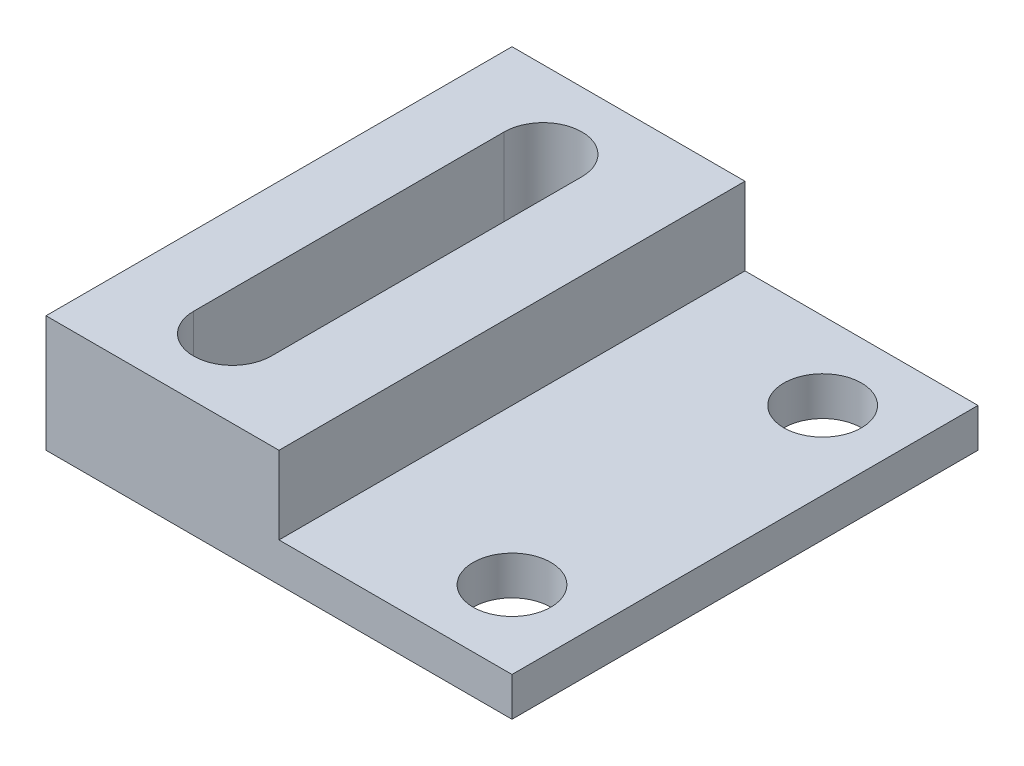
ISO-10303-21;
HEADER;
FILE_DESCRIPTION(('STEP AP214'),'2;1');
FILE_NAME('part.step','',(''),(''),'','','');
FILE_SCHEMA(('AUTOMOTIVE_DESIGN { 1 0 10303 214 1 1 1 1 }'));
ENDSEC;
DATA;
#1=APPLICATION_CONTEXT('core data for automotive mechanical design processes');
#2=APPLICATION_PROTOCOL_DEFINITION('international standard','automotive_design',2000,#1);
#3=PRODUCT_CONTEXT('',#1,'mechanical');
#4=PRODUCT('Part','Part','',(#3));
#5=PRODUCT_RELATED_PRODUCT_CATEGORY('part','',(#4));
#6=PRODUCT_DEFINITION_FORMATION('','',#4);
#7=PRODUCT_DEFINITION_CONTEXT('part definition',#1,'design');
#8=PRODUCT_DEFINITION('design','',#6,#7);
#9=PRODUCT_DEFINITION_SHAPE('','',#8);
#10=(LENGTH_UNIT() NAMED_UNIT(*) SI_UNIT(.MILLI.,.METRE.));
#11=(NAMED_UNIT(*) PLANE_ANGLE_UNIT() SI_UNIT($,.RADIAN.));
#12=(NAMED_UNIT(*) SI_UNIT($,.STERADIAN.) SOLID_ANGLE_UNIT());
#13=UNCERTAINTY_MEASURE_WITH_UNIT(LENGTH_MEASURE(1.E-05),#10,'distance_accuracy_value','');
#14=(GEOMETRIC_REPRESENTATION_CONTEXT(3) GLOBAL_UNCERTAINTY_ASSIGNED_CONTEXT((#13)) GLOBAL_UNIT_ASSIGNED_CONTEXT((#10,
#11,#12)) REPRESENTATION_CONTEXT('',''));
#15=CARTESIAN_POINT('',(0.,0.,0.));
#16=DIRECTION('',(0.,0.,1.));
#17=DIRECTION('',(1.,0.,0.));
#18=AXIS2_PLACEMENT_3D('',#15,#16,#17);
#19=CARTESIAN_POINT('',(19.05,-4.7625,19.05));
#20=DIRECTION('',(-1.,0.,0.));
#21=DIRECTION('',(0.,0.,1.));
#22=AXIS2_PLACEMENT_3D('',#19,#20,#21);
#23=PLANE('',#22);
#24=DIRECTION('',(0.,1.,0.));
#25=VECTOR('',#24,1.);
#26=CARTESIAN_POINT('',(19.05,-4.7625,-19.05));
#27=LINE('',#26,#25);
#28=CARTESIAN_POINT('',(19.05,-4.7625,-19.05));
#29=VERTEX_POINT('',#28);
#30=CARTESIAN_POINT('',(19.05,-1.5875,-19.05));
#31=VERTEX_POINT('',#30);
#32=EDGE_CURVE('E186',#29,#31,#27,.T.);
#33=ORIENTED_EDGE('',*,*,#32,.T.);
#34=DIRECTION('',(0.,0.,1.));
#35=VECTOR('',#34,1.);
#36=CARTESIAN_POINT('',(19.05,-1.5875,-19.05));
#37=LINE('',#36,#35);
#38=CARTESIAN_POINT('',(19.05,-1.5875,19.05));
#39=VERTEX_POINT('',#38);
#40=EDGE_CURVE('E187',#31,#39,#37,.T.);
#41=ORIENTED_EDGE('',*,*,#40,.T.);
#42=DIRECTION('',(0.,1.,0.));
#43=VECTOR('',#42,1.);
#44=CARTESIAN_POINT('',(19.05,-4.7625,19.05));
#45=LINE('',#44,#43);
#46=CARTESIAN_POINT('',(19.05,-4.7625,19.05));
#47=VERTEX_POINT('',#46);
#48=EDGE_CURVE('E193',#47,#39,#45,.T.);
#49=ORIENTED_EDGE('',*,*,#48,.F.);
#50=DIRECTION('',(0.,0.,-1.));
#51=VECTOR('',#50,1.);
#52=CARTESIAN_POINT('',(19.05,-4.7625,19.05));
#53=LINE('',#52,#51);
#54=EDGE_CURVE('E207',#47,#29,#53,.T.);
#55=ORIENTED_EDGE('',*,*,#54,.T.);
#56=EDGE_LOOP('',(#33,#41,#49,#55));
#57=FACE_BOUND('',#56,.T.);
#58=ADVANCED_FACE('F39',(#57),#23,.F.);
#59=CARTESIAN_POINT('',(-19.05,4.7625,19.05));
#60=DIRECTION('',(0.,-1.,0.));
#61=DIRECTION('',(0.,0.,-1.));
#62=AXIS2_PLACEMENT_3D('',#59,#60,#61);
#63=PLANE('',#62);
#64=DIRECTION('',(0.,0.,-1.));
#65=VECTOR('',#64,1.);
#66=CARTESIAN_POINT('',(-6.985,4.7625,12.7));
#67=LINE('',#66,#65);
#68=CARTESIAN_POINT('',(-6.985,4.7625,12.7));
#69=VERTEX_POINT('',#68);
#70=CARTESIAN_POINT('',(-6.985,4.7625,-12.7));
#71=VERTEX_POINT('',#70);
#72=EDGE_CURVE('E129',#69,#71,#67,.T.);
#73=ORIENTED_EDGE('',*,*,#72,.F.);
#74=CARTESIAN_POINT('',(-10.16,4.7625,12.7));
#75=DIRECTION('',(0.,1.,0.));
#76=DIRECTION('',(0.,0.,1.));
#77=AXIS2_PLACEMENT_3D('',#74,#75,#76);
#78=CIRCLE('',#77,3.175);
#79=CARTESIAN_POINT('',(-13.335,4.7625,12.7));
#80=VERTEX_POINT('',#79);
#81=EDGE_CURVE('E54',#80,#69,#78,.T.);
#82=ORIENTED_EDGE('',*,*,#81,.F.);
#83=DIRECTION('',(0.,0.,1.));
#84=VECTOR('',#83,1.);
#85=CARTESIAN_POINT('',(-13.335,4.7625,12.7));
#86=LINE('',#85,#84);
#87=CARTESIAN_POINT('',(-13.335,4.7625,-12.7));
#88=VERTEX_POINT('',#87);
#89=EDGE_CURVE('E137',#88,#80,#86,.T.);
#90=ORIENTED_EDGE('',*,*,#89,.F.);
#91=CARTESIAN_POINT('',(-10.16,4.7625,-12.7));
#92=DIRECTION('',(0.,1.,0.));
#93=DIRECTION('',(0.,0.,1.));
#94=AXIS2_PLACEMENT_3D('',#91,#92,#93);
#95=CIRCLE('',#94,3.175);
#96=EDGE_CURVE('E119',#71,#88,#95,.T.);
#97=ORIENTED_EDGE('',*,*,#96,.F.);
#98=EDGE_LOOP('',(#73,#82,#90,#97));
#99=FACE_BOUND('',#98,.T.);
#100=DIRECTION('',(-1.,0.,0.));
#101=VECTOR('',#100,1.);
#102=CARTESIAN_POINT('',(-19.05,4.7625,19.05));
#103=LINE('',#102,#101);
#104=CARTESIAN_POINT('',(0.,4.7625,19.05));
#105=VERTEX_POINT('',#104);
#106=CARTESIAN_POINT('',(-19.05,4.7625,19.05));
#107=VERTEX_POINT('',#106);
#108=EDGE_CURVE('E197',#105,#107,#103,.T.);
#109=ORIENTED_EDGE('',*,*,#108,.F.);
#110=DIRECTION('',(0.,0.,1.));
#111=VECTOR('',#110,1.);
#112=CARTESIAN_POINT('',(0.,4.7625,-19.05));
#113=LINE('',#112,#111);
#114=CARTESIAN_POINT('',(0.,4.7625,-19.05));
#115=VERTEX_POINT('',#114);
#116=EDGE_CURVE('E183',#115,#105,#113,.T.);
#117=ORIENTED_EDGE('',*,*,#116,.F.);
#118=DIRECTION('',(-1.,0.,0.));
#119=VECTOR('',#118,1.);
#120=CARTESIAN_POINT('',(-19.05,4.7625,-19.05));
#121=LINE('',#120,#119);
#122=CARTESIAN_POINT('',(-19.05,4.7625,-19.05));
#123=VERTEX_POINT('',#122);
#124=EDGE_CURVE('E211',#115,#123,#121,.T.);
#125=ORIENTED_EDGE('',*,*,#124,.T.);
#126=DIRECTION('',(0.,0.,-1.));
#127=VECTOR('',#126,1.);
#128=CARTESIAN_POINT('',(-19.05,4.7625,19.05));
#129=LINE('',#128,#127);
#130=EDGE_CURVE('E226',#107,#123,#129,.T.);
#131=ORIENTED_EDGE('',*,*,#130,.F.);
#132=EDGE_LOOP('',(#109,#117,#125,#131));
#133=FACE_BOUND('',#132,.T.);
#134=ADVANCED_FACE('F134',(#99,#133),#63,.F.);
#135=CARTESIAN_POINT('',(-19.05,-4.7625,19.05));
#136=DIRECTION('',(1.,0.,0.));
#137=DIRECTION('',(0.,0.,-1.));
#138=AXIS2_PLACEMENT_3D('',#135,#136,#137);
#139=PLANE('',#138);
#140=DIRECTION('',(0.,-1.,0.));
#141=VECTOR('',#140,1.);
#142=CARTESIAN_POINT('',(-19.05,-4.7625,-19.05));
#143=LINE('',#142,#141);
#144=CARTESIAN_POINT('',(-19.05,-4.7625,-19.05));
#145=VERTEX_POINT('',#144);
#146=EDGE_CURVE('E214',#123,#145,#143,.T.);
#147=ORIENTED_EDGE('',*,*,#146,.T.);
#148=DIRECTION('',(0.,0.,-1.));
#149=VECTOR('',#148,1.);
#150=CARTESIAN_POINT('',(-19.05,-4.7625,19.05));
#151=LINE('',#150,#149);
#152=CARTESIAN_POINT('',(-19.05,-4.7625,19.05));
#153=VERTEX_POINT('',#152);
#154=EDGE_CURVE('E222',#153,#145,#151,.T.);
#155=ORIENTED_EDGE('',*,*,#154,.F.);
#156=DIRECTION('',(0.,-1.,0.));
#157=VECTOR('',#156,1.);
#158=CARTESIAN_POINT('',(-19.05,-4.7625,19.05));
#159=LINE('',#158,#157);
#160=EDGE_CURVE('E201',#107,#153,#159,.T.);
#161=ORIENTED_EDGE('',*,*,#160,.F.);
#162=ORIENTED_EDGE('',*,*,#130,.T.);
#163=EDGE_LOOP('',(#147,#155,#161,#162));
#164=FACE_BOUND('',#163,.T.);
#165=ADVANCED_FACE('F260',(#164),#139,.F.);
#166=CARTESIAN_POINT('',(-19.05,-4.7625,19.05));
#167=DIRECTION('',(0.,1.,0.));
#168=DIRECTION('',(0.,0.,1.));
#169=AXIS2_PLACEMENT_3D('',#166,#167,#168);
#170=PLANE('',#169);
#171=DIRECTION('',(0.,0.,1.));
#172=VECTOR('',#171,1.);
#173=CARTESIAN_POINT('',(-13.335,-4.7625,19.05));
#174=LINE('',#173,#172);
#175=CARTESIAN_POINT('',(-13.335,-4.7625,-12.7));
#176=VERTEX_POINT('',#175);
#177=CARTESIAN_POINT('',(-13.335,-4.7625,12.7));
#178=VERTEX_POINT('',#177);
#179=EDGE_CURVE('E47',#176,#178,#174,.T.);
#180=ORIENTED_EDGE('',*,*,#179,.T.);
#181=CARTESIAN_POINT('',(-10.16,-4.7625,12.7));
#182=DIRECTION('',(0.,1.,0.));
#183=DIRECTION('',(0.,0.,1.));
#184=AXIS2_PLACEMENT_3D('',#181,#182,#183);
#185=CIRCLE('',#184,3.175);
#186=CARTESIAN_POINT('',(-6.985,-4.7625,12.7));
#187=VERTEX_POINT('',#186);
#188=EDGE_CURVE('E11',#178,#187,#185,.T.);
#189=ORIENTED_EDGE('',*,*,#188,.T.);
#190=DIRECTION('',(0.,0.,-1.));
#191=VECTOR('',#190,1.);
#192=CARTESIAN_POINT('',(-6.985,-4.7625,19.05));
#193=LINE('',#192,#191);
#194=CARTESIAN_POINT('',(-6.985,-4.7625,-12.7));
#195=VERTEX_POINT('',#194);
#196=EDGE_CURVE('E230',#187,#195,#193,.T.);
#197=ORIENTED_EDGE('',*,*,#196,.T.);
#198=CARTESIAN_POINT('',(-10.16,-4.7625,-12.7));
#199=DIRECTION('',(0.,1.,0.));
#200=DIRECTION('',(0.,0.,1.));
#201=AXIS2_PLACEMENT_3D('',#198,#199,#200);
#202=CIRCLE('',#201,3.175);
#203=EDGE_CURVE('E122',#195,#176,#202,.T.);
#204=ORIENTED_EDGE('',*,*,#203,.T.);
#205=EDGE_LOOP('',(#180,#189,#197,#204));
#206=FACE_BOUND('',#205,.T.);
#207=CARTESIAN_POINT('',(12.7,-4.7625,-12.7));
#208=DIRECTION('',(0.,1.,0.));
#209=DIRECTION('',(0.,0.,1.));
#210=AXIS2_PLACEMENT_3D('',#207,#208,#209);
#211=CIRCLE('',#210,3.175);
#212=CARTESIAN_POINT('',(12.7,-4.7625,-9.525));
#213=VERTEX_POINT('',#212);
#214=EDGE_CURVE('E155',#213,#213,#211,.T.);
#215=ORIENTED_EDGE('',*,*,#214,.T.);
#216=EDGE_LOOP('',(#215));
#217=FACE_BOUND('',#216,.T.);
#218=CARTESIAN_POINT('',(12.7,-4.7625,12.7));
#219=DIRECTION('',(0.,1.,0.));
#220=DIRECTION('',(0.,0.,1.));
#221=AXIS2_PLACEMENT_3D('',#218,#219,#220);
#222=CIRCLE('',#221,3.175);
#223=CARTESIAN_POINT('',(12.7,-4.7625,15.875));
#224=VERTEX_POINT('',#223);
#225=EDGE_CURVE('E163',#224,#224,#222,.T.);
#226=ORIENTED_EDGE('',*,*,#225,.T.);
#227=EDGE_LOOP('',(#226));
#228=FACE_BOUND('',#227,.T.);
#229=DIRECTION('',(1.,0.,0.));
#230=VECTOR('',#229,1.);
#231=CARTESIAN_POINT('',(-19.05,-4.7625,-19.05));
#232=LINE('',#231,#230);
#233=EDGE_CURVE('E198',#145,#29,#232,.T.);
#234=ORIENTED_EDGE('',*,*,#233,.T.);
#235=ORIENTED_EDGE('',*,*,#54,.F.);
#236=DIRECTION('',(1.,0.,0.));
#237=VECTOR('',#236,1.);
#238=CARTESIAN_POINT('',(-19.05,-4.7625,19.05));
#239=LINE('',#238,#237);
#240=EDGE_CURVE('E204',#153,#47,#239,.T.);
#241=ORIENTED_EDGE('',*,*,#240,.F.);
#242=ORIENTED_EDGE('',*,*,#154,.T.);
#243=EDGE_LOOP('',(#234,#235,#241,#242));
#244=FACE_BOUND('',#243,.T.);
#245=ADVANCED_FACE('F237',(#206,#217,#228,#244),#170,.F.);
#246=CARTESIAN_POINT('',(0.,0.,19.05));
#247=DIRECTION('',(0.,0.,-1.));
#248=DIRECTION('',(-1.,0.,0.));
#249=AXIS2_PLACEMENT_3D('',#246,#247,#248);
#250=PLANE('',#249);
#251=DIRECTION('',(1.,0.,0.));
#252=VECTOR('',#251,1.);
#253=CARTESIAN_POINT('',(0.,-1.5875,19.05));
#254=LINE('',#253,#252);
#255=CARTESIAN_POINT('',(0.,-1.5875,19.05));
#256=VERTEX_POINT('',#255);
#257=EDGE_CURVE('E173',#256,#39,#254,.T.);
#258=ORIENTED_EDGE('',*,*,#257,.F.);
#259=DIRECTION('',(0.,-1.,0.));
#260=VECTOR('',#259,1.);
#261=CARTESIAN_POINT('',(0.,-1.5875,19.05));
#262=LINE('',#261,#260);
#263=EDGE_CURVE('E167',#105,#256,#262,.T.);
#264=ORIENTED_EDGE('',*,*,#263,.F.);
#265=ORIENTED_EDGE('',*,*,#108,.T.);
#266=ORIENTED_EDGE('',*,*,#160,.T.);
#267=ORIENTED_EDGE('',*,*,#240,.T.);
#268=ORIENTED_EDGE('',*,*,#48,.T.);
#269=EDGE_LOOP('',(#258,#264,#265,#266,#267,#268));
#270=FACE_BOUND('',#269,.T.);
#271=ADVANCED_FACE('F275',(#270),#250,.F.);
#272=CARTESIAN_POINT('',(0.,0.,-19.05));
#273=DIRECTION('',(0.,0.,-1.));
#274=DIRECTION('',(-1.,0.,0.));
#275=AXIS2_PLACEMENT_3D('',#272,#273,#274);
#276=PLANE('',#275);
#277=DIRECTION('',(0.,-1.,0.));
#278=VECTOR('',#277,1.);
#279=CARTESIAN_POINT('',(0.,-1.5875,-19.05));
#280=LINE('',#279,#278);
#281=CARTESIAN_POINT('',(0.,-1.5875,-19.05));
#282=VERTEX_POINT('',#281);
#283=EDGE_CURVE('E168',#115,#282,#280,.T.);
#284=ORIENTED_EDGE('',*,*,#283,.T.);
#285=DIRECTION('',(1.,0.,0.));
#286=VECTOR('',#285,1.);
#287=CARTESIAN_POINT('',(0.,-1.5875,-19.05));
#288=LINE('',#287,#286);
#289=EDGE_CURVE('E172',#282,#31,#288,.T.);
#290=ORIENTED_EDGE('',*,*,#289,.T.);
#291=ORIENTED_EDGE('',*,*,#32,.F.);
#292=ORIENTED_EDGE('',*,*,#233,.F.);
#293=ORIENTED_EDGE('',*,*,#146,.F.);
#294=ORIENTED_EDGE('',*,*,#124,.F.);
#295=EDGE_LOOP('',(#284,#290,#291,#292,#293,#294));
#296=FACE_BOUND('',#295,.T.);
#297=ADVANCED_FACE('F266',(#296),#276,.T.);
#298=CARTESIAN_POINT('',(0.,-1.5875,-19.05));
#299=DIRECTION('',(-1.,0.,0.));
#300=DIRECTION('',(0.,0.,1.));
#301=AXIS2_PLACEMENT_3D('',#298,#299,#300);
#302=PLANE('',#301);
#303=ORIENTED_EDGE('',*,*,#263,.T.);
#304=DIRECTION('',(0.,0.,1.));
#305=VECTOR('',#304,1.);
#306=CARTESIAN_POINT('',(0.,-1.5875,-19.05));
#307=LINE('',#306,#305);
#308=EDGE_CURVE('E177',#282,#256,#307,.T.);
#309=ORIENTED_EDGE('',*,*,#308,.F.);
#310=ORIENTED_EDGE('',*,*,#283,.F.);
#311=ORIENTED_EDGE('',*,*,#116,.T.);
#312=EDGE_LOOP('',(#303,#309,#310,#311));
#313=FACE_BOUND('',#312,.T.);
#314=ADVANCED_FACE('F285',(#313),#302,.F.);
#315=CARTESIAN_POINT('',(0.,-1.5875,-19.05));
#316=DIRECTION('',(0.,-1.,0.));
#317=DIRECTION('',(0.,0.,-1.));
#318=AXIS2_PLACEMENT_3D('',#315,#316,#317);
#319=PLANE('',#318);
#320=CARTESIAN_POINT('',(12.7,-1.5875,-12.7));
#321=DIRECTION('',(0.,1.,0.));
#322=DIRECTION('',(0.,0.,1.));
#323=AXIS2_PLACEMENT_3D('',#320,#321,#322);
#324=CIRCLE('',#323,3.17499999999999);
#325=CARTESIAN_POINT('',(12.7,-1.5875,-9.52500000000001));
#326=VERTEX_POINT('',#325);
#327=EDGE_CURVE('E147',#326,#326,#324,.T.);
#328=ORIENTED_EDGE('',*,*,#327,.F.);
#329=EDGE_LOOP('',(#328));
#330=FACE_BOUND('',#329,.T.);
#331=CARTESIAN_POINT('',(12.7,-1.5875,12.7));
#332=DIRECTION('',(0.,1.,0.));
#333=DIRECTION('',(0.,0.,1.));
#334=AXIS2_PLACEMENT_3D('',#331,#332,#333);
#335=CIRCLE('',#334,3.17499999999999);
#336=CARTESIAN_POINT('',(12.7,-1.5875,15.875));
#337=VERTEX_POINT('',#336);
#338=EDGE_CURVE('E159',#337,#337,#335,.T.);
#339=ORIENTED_EDGE('',*,*,#338,.F.);
#340=EDGE_LOOP('',(#339));
#341=FACE_BOUND('',#340,.T.);
#342=ORIENTED_EDGE('',*,*,#257,.T.);
#343=ORIENTED_EDGE('',*,*,#40,.F.);
#344=ORIENTED_EDGE('',*,*,#289,.F.);
#345=ORIENTED_EDGE('',*,*,#308,.T.);
#346=EDGE_LOOP('',(#342,#343,#344,#345));
#347=FACE_BOUND('',#346,.T.);
#348=ADVANCED_FACE('F271',(#330,#341,#347),#319,.F.);
#349=CARTESIAN_POINT('',(12.7,-1.5875,12.7));
#350=DIRECTION('',(0.,1.,0.));
#351=DIRECTION('',(0.,0.,1.));
#352=AXIS2_PLACEMENT_3D('',#349,#350,#351);
#353=CYLINDRICAL_SURFACE('',#352,3.17499999999999);
#354=ORIENTED_EDGE('',*,*,#225,.F.);
#355=EDGE_LOOP('',(#354));
#356=FACE_BOUND('',#355,.T.);
#357=ORIENTED_EDGE('',*,*,#338,.T.);
#358=EDGE_LOOP('',(#357));
#359=FACE_BOUND('',#358,.T.);
#360=ADVANCED_FACE('F251',(#356,#359),#353,.F.);
#361=CARTESIAN_POINT('',(12.7,-1.5875,-12.7));
#362=DIRECTION('',(0.,1.,0.));
#363=DIRECTION('',(0.,0.,1.));
#364=AXIS2_PLACEMENT_3D('',#361,#362,#363);
#365=CYLINDRICAL_SURFACE('',#364,3.17499999999999);
#366=ORIENTED_EDGE('',*,*,#214,.F.);
#367=EDGE_LOOP('',(#366));
#368=FACE_BOUND('',#367,.T.);
#369=ORIENTED_EDGE('',*,*,#327,.T.);
#370=EDGE_LOOP('',(#369));
#371=FACE_BOUND('',#370,.T.);
#372=ADVANCED_FACE('F244',(#368,#371),#365,.F.);
#373=CARTESIAN_POINT('',(-10.16,-26.9875,12.7));
#374=DIRECTION('',(0.,1.,0.));
#375=DIRECTION('',(0.,0.,1.));
#376=AXIS2_PLACEMENT_3D('',#373,#374,#375);
#377=CYLINDRICAL_SURFACE('',#376,3.175);
#378=DIRECTION('',(0.,1.,0.));
#379=VECTOR('',#378,1.);
#380=CARTESIAN_POINT('',(-13.335,-26.9875,12.7));
#381=LINE('',#380,#379);
#382=EDGE_CURVE('E144',#178,#80,#381,.T.);
#383=ORIENTED_EDGE('',*,*,#382,.T.);
#384=ORIENTED_EDGE('',*,*,#81,.T.);
#385=DIRECTION('',(0.,1.,0.));
#386=VECTOR('',#385,1.);
#387=CARTESIAN_POINT('',(-6.985,-26.9875,12.7));
#388=LINE('',#387,#386);
#389=EDGE_CURVE('E126',#187,#69,#388,.T.);
#390=ORIENTED_EDGE('',*,*,#389,.F.);
#391=ORIENTED_EDGE('',*,*,#188,.F.);
#392=EDGE_LOOP('',(#383,#384,#390,#391));
#393=FACE_BOUND('',#392,.T.);
#394=ADVANCED_FACE('F242',(#393),#377,.F.);
#395=CARTESIAN_POINT('',(-13.335,-26.9875,12.7));
#396=DIRECTION('',(-1.,0.,0.));
#397=DIRECTION('',(0.,0.,1.));
#398=AXIS2_PLACEMENT_3D('',#395,#396,#397);
#399=PLANE('',#398);
#400=DIRECTION('',(0.,1.,0.));
#401=VECTOR('',#400,1.);
#402=CARTESIAN_POINT('',(-13.335,-26.9875,-12.7));
#403=LINE('',#402,#401);
#404=EDGE_CURVE('E125',#176,#88,#403,.T.);
#405=ORIENTED_EDGE('',*,*,#404,.T.);
#406=ORIENTED_EDGE('',*,*,#89,.T.);
#407=ORIENTED_EDGE('',*,*,#382,.F.);
#408=ORIENTED_EDGE('',*,*,#179,.F.);
#409=EDGE_LOOP('',(#405,#406,#407,#408));
#410=FACE_BOUND('',#409,.T.);
#411=ADVANCED_FACE('F241',(#410),#399,.F.);
#412=CARTESIAN_POINT('',(-10.16,-26.9875,-12.7));
#413=DIRECTION('',(0.,1.,0.));
#414=DIRECTION('',(0.,0.,1.));
#415=AXIS2_PLACEMENT_3D('',#412,#413,#414);
#416=CYLINDRICAL_SURFACE('',#415,3.175);
#417=DIRECTION('',(0.,1.,0.));
#418=VECTOR('',#417,1.);
#419=CARTESIAN_POINT('',(-6.985,-26.9875,-12.7));
#420=LINE('',#419,#418);
#421=EDGE_CURVE('E62',#195,#71,#420,.T.);
#422=ORIENTED_EDGE('',*,*,#421,.T.);
#423=ORIENTED_EDGE('',*,*,#96,.T.);
#424=ORIENTED_EDGE('',*,*,#404,.F.);
#425=ORIENTED_EDGE('',*,*,#203,.F.);
#426=EDGE_LOOP('',(#422,#423,#424,#425));
#427=FACE_BOUND('',#426,.T.);
#428=ADVANCED_FACE('F116',(#427),#416,.F.);
#429=CARTESIAN_POINT('',(-6.985,-26.9875,12.7));
#430=DIRECTION('',(1.,0.,0.));
#431=DIRECTION('',(0.,0.,-1.));
#432=AXIS2_PLACEMENT_3D('',#429,#430,#431);
#433=PLANE('',#432);
#434=ORIENTED_EDGE('',*,*,#389,.T.);
#435=ORIENTED_EDGE('',*,*,#72,.T.);
#436=ORIENTED_EDGE('',*,*,#421,.F.);
#437=ORIENTED_EDGE('',*,*,#196,.F.);
#438=EDGE_LOOP('',(#434,#435,#436,#437));
#439=FACE_BOUND('',#438,.T.);
#440=ADVANCED_FACE('F130',(#439),#433,.F.);
#441=CLOSED_SHELL('',(#58,#134,#165,#245,#271,#297,#314,#348,#360,#372,#394,#411,#428,#440));
#442=MANIFOLD_SOLID_BREP('B2',#441);
#443=ADVANCED_BREP_SHAPE_REPRESENTATION('',(#18,#442),#14);
#444=SHAPE_DEFINITION_REPRESENTATION(#9,#443);
ENDSEC;
END-ISO-10303-21;
